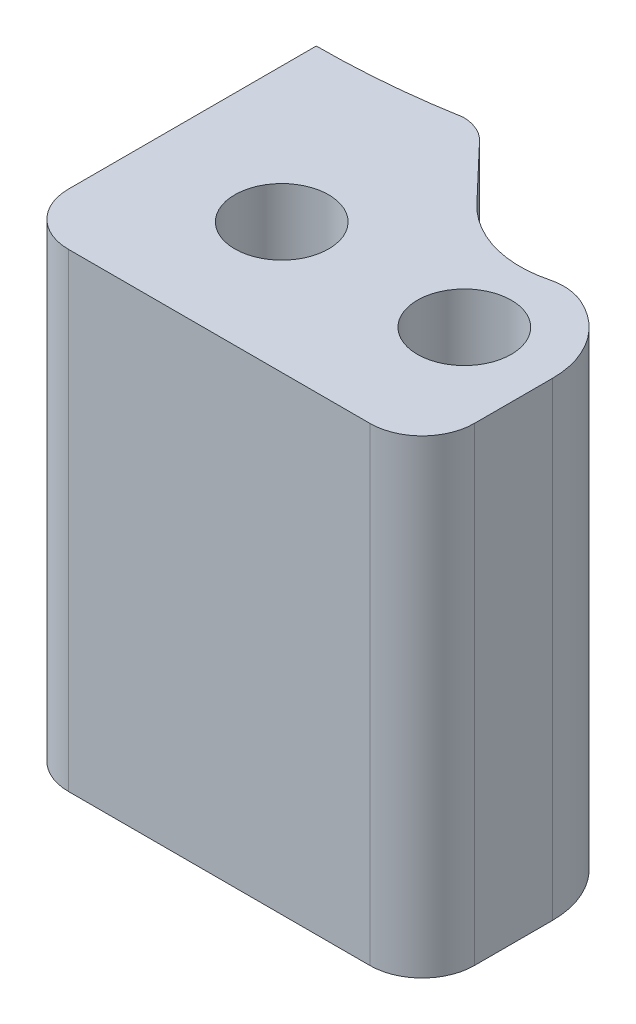
ISO-10303-21;
HEADER;
FILE_DESCRIPTION(('STEP AP214'),'2;1');
FILE_NAME('part.step','',(''),(''),'','','');
FILE_SCHEMA(('AUTOMOTIVE_DESIGN { 1 0 10303 214 1 1 1 1 }'));
ENDSEC;
DATA;
#1=APPLICATION_CONTEXT('core data for automotive mechanical design processes');
#2=APPLICATION_PROTOCOL_DEFINITION('international standard','automotive_design',2000,#1);
#3=PRODUCT_CONTEXT('',#1,'mechanical');
#4=PRODUCT('Part','Part','',(#3));
#5=PRODUCT_RELATED_PRODUCT_CATEGORY('part','',(#4));
#6=PRODUCT_DEFINITION_FORMATION('','',#4);
#7=PRODUCT_DEFINITION_CONTEXT('part definition',#1,'design');
#8=PRODUCT_DEFINITION('design','',#6,#7);
#9=PRODUCT_DEFINITION_SHAPE('','',#8);
#10=(LENGTH_UNIT() NAMED_UNIT(*) SI_UNIT(.MILLI.,.METRE.));
#11=(NAMED_UNIT(*) PLANE_ANGLE_UNIT() SI_UNIT($,.RADIAN.));
#12=(NAMED_UNIT(*) SI_UNIT($,.STERADIAN.) SOLID_ANGLE_UNIT());
#13=UNCERTAINTY_MEASURE_WITH_UNIT(LENGTH_MEASURE(1.E-05),#10,'distance_accuracy_value','');
#14=(GEOMETRIC_REPRESENTATION_CONTEXT(3) GLOBAL_UNCERTAINTY_ASSIGNED_CONTEXT((#13)) GLOBAL_UNIT_ASSIGNED_CONTEXT((#10,
#11,#12)) REPRESENTATION_CONTEXT('',''));
#15=CARTESIAN_POINT('',(0.,0.,0.));
#16=DIRECTION('',(0.,0.,1.));
#17=DIRECTION('',(1.,0.,0.));
#18=AXIS2_PLACEMENT_3D('',#15,#16,#17);
#19=CARTESIAN_POINT('',(0.,18.,0.));
#20=DIRECTION('',(0.,1.,0.));
#21=DIRECTION('',(0.,0.,1.));
#22=AXIS2_PLACEMENT_3D('',#19,#20,#21);
#23=PLANE('',#22);
#24=CARTESIAN_POINT('',(12.1760216382855,18.,36.32));
#25=DIRECTION('',(0.,1.,0.));
#26=DIRECTION('',(0.,0.,1.));
#27=AXIS2_PLACEMENT_3D('',#24,#25,#26);
#28=CIRCLE('',#27,1.8);
#29=CARTESIAN_POINT('',(12.1760216382855,18.,38.12));
#30=VERTEX_POINT('',#29);
#31=EDGE_CURVE('E236',#30,#30,#28,.T.);
#32=ORIENTED_EDGE('',*,*,#31,.F.);
#33=EDGE_LOOP('',(#32));
#34=FACE_BOUND('',#33,.T.);
#35=DIRECTION('',(1.,0.,0.));
#36=VECTOR('',#35,1.);
#37=CARTESIAN_POINT('',(0.,18.,41.32));
#38=LINE('',#37,#36);
#39=CARTESIAN_POINT('',(2.,18.,41.32));
#40=VERTEX_POINT('',#39);
#41=CARTESIAN_POINT('',(13.5596561957787,18.,41.32));
#42=VERTEX_POINT('',#41);
#43=EDGE_CURVE('E133',#40,#42,#38,.T.);
#44=ORIENTED_EDGE('',*,*,#43,.T.);
#45=CARTESIAN_POINT('',(13.5596561957787,18.,39.32));
#46=DIRECTION('',(0.,1.,0.));
#47=DIRECTION('',(0.,0.,1.));
#48=AXIS2_PLACEMENT_3D('',#45,#46,#47);
#49=CIRCLE('',#48,2.);
#50=CARTESIAN_POINT('',(15.5596561957787,18.,39.32));
#51=VERTEX_POINT('',#50);
#52=EDGE_CURVE('E47',#42,#51,#49,.T.);
#53=ORIENTED_EDGE('',*,*,#52,.T.);
#54=DIRECTION('',(0.,0.,-1.));
#55=VECTOR('',#54,1.);
#56=CARTESIAN_POINT('',(15.5596561957787,18.,36.32));
#57=LINE('',#56,#55);
#58=CARTESIAN_POINT('',(15.5596561957787,18.,36.32));
#59=VERTEX_POINT('',#58);
#60=EDGE_CURVE('E170',#51,#59,#57,.T.);
#61=ORIENTED_EDGE('',*,*,#60,.T.);
#62=CARTESIAN_POINT('',(12.1760216382855,18.,36.32));
#63=DIRECTION('',(0.,1.,0.));
#64=DIRECTION('',(0.,0.,-1.));
#65=AXIS2_PLACEMENT_3D('',#62,#63,#64);
#66=CIRCLE('',#65,3.3836345574932);
#67=CARTESIAN_POINT('',(13.5126850082592,18.,33.2115737335377));
#68=VERTEX_POINT('',#67);
#69=EDGE_CURVE('E172',#59,#68,#66,.T.);
#70=ORIENTED_EDGE('',*,*,#69,.T.);
#71=CARTESIAN_POINT('',(12.7226095156126,18.,35.048903512298));
#72=DIRECTION('',(0.,1.,0.));
#73=DIRECTION('',(0.,0.,-1.));
#74=AXIS2_PLACEMENT_3D('',#71,#72,#73);
#75=CIRCLE('',#74,2.00000000000001);
#76=CARTESIAN_POINT('',(12.2249213100975,18.,33.1118164078829));
#77=VERTEX_POINT('',#76);
#78=EDGE_CURVE('E218',#68,#77,#75,.T.);
#79=ORIENTED_EDGE('',*,*,#78,.T.);
#80=CARTESIAN_POINT('',(11.2295448990672,18.,29.2376421990528));
#81=DIRECTION('',(0.,-1.,0.));
#82=DIRECTION('',(0.,0.,1.));
#83=AXIS2_PLACEMENT_3D('',#80,#81,#82);
#84=CIRCLE('',#83,4.);
#85=CARTESIAN_POINT('',(8.33363914292527,18.,31.9969409961286));
#86=VERTEX_POINT('',#85);
#87=EDGE_CURVE('E235',#77,#86,#84,.T.);
#88=ORIENTED_EDGE('',*,*,#87,.T.);
#89=DIRECTION('',(-0.689824699268947,0.,-0.723976439035489));
#90=VECTOR('',#89,1.);
#91=CARTESIAN_POINT('',(6.27790563370873,18.,29.8394325346517));
#92=LINE('',#91,#90);
#93=CARTESIAN_POINT('',(6.27790563370873,18.,29.8394325346517));
#94=VERTEX_POINT('',#93);
#95=EDGE_CURVE('E231',#86,#94,#92,.T.);
#96=ORIENTED_EDGE('',*,*,#95,.T.);
#97=CARTESIAN_POINT('',(5.1760216382855,18.,30.8893379663599));
#98=DIRECTION('',(0.,1.,0.));
#99=DIRECTION('',(0.,0.,-1.));
#100=AXIS2_PLACEMENT_3D('',#97,#98,#99);
#101=CIRCLE('',#100,1.52198874992562);
#102=CARTESIAN_POINT('',(5.1760216382855,18.,29.3673492164342));
#103=VERTEX_POINT('',#102);
#104=EDGE_CURVE('E136',#94,#103,#101,.T.);
#105=ORIENTED_EDGE('',*,*,#104,.T.);
#106=CARTESIAN_POINT('',(0.,18.,0.));
#107=DIRECTION('',(0.,-1.,0.));
#108=DIRECTION('',(0.,0.,1.));
#109=AXIS2_PLACEMENT_3D('',#106,#107,#108);
#110=CIRCLE('',#109,29.82);
#111=CARTESIAN_POINT('',(1.58912882852746E-13,18.,29.82));
#112=VERTEX_POINT('',#111);
#113=EDGE_CURVE('E135',#103,#112,#110,.T.);
#114=ORIENTED_EDGE('',*,*,#113,.T.);
#115=DIRECTION('',(-1.04203312645268E-13,0.,1.));
#116=VECTOR('',#115,1.);
#117=CARTESIAN_POINT('',(0.,18.,31.32));
#118=LINE('',#117,#116);
#119=CARTESIAN_POINT('',(-8.31018587277298E-13,18.,39.32));
#120=VERTEX_POINT('',#119);
#121=EDGE_CURVE('E125',#112,#120,#118,.T.);
#122=ORIENTED_EDGE('',*,*,#121,.T.);
#123=CARTESIAN_POINT('',(2.,18.,39.32));
#124=DIRECTION('',(0.,1.,0.));
#125=DIRECTION('',(0.,0.,1.));
#126=AXIS2_PLACEMENT_3D('',#123,#124,#125);
#127=CIRCLE('',#126,2.);
#128=EDGE_CURVE('E163',#120,#40,#127,.T.);
#129=ORIENTED_EDGE('',*,*,#128,.T.);
#130=EDGE_LOOP('',(#44,#53,#61,#70,#79,#88,#96,#105,#114,#122,#129));
#131=FACE_BOUND('',#130,.T.);
#132=CARTESIAN_POINT('',(5.1760216382855,18.,36.32));
#133=DIRECTION('',(0.,1.,0.));
#134=DIRECTION('',(0.,0.,1.));
#135=AXIS2_PLACEMENT_3D('',#132,#133,#134);
#136=CIRCLE('',#135,1.8);
#137=CARTESIAN_POINT('',(5.1760216382855,18.,38.12));
#138=VERTEX_POINT('',#137);
#139=EDGE_CURVE('E242',#138,#138,#136,.T.);
#140=ORIENTED_EDGE('',*,*,#139,.F.);
#141=EDGE_LOOP('',(#140));
#142=FACE_BOUND('',#141,.T.);
#143=ADVANCED_FACE('F41',(#34,#131,#142),#23,.T.);
#144=CARTESIAN_POINT('',(0.,0.,0.));
#145=DIRECTION('',(0.,1.,0.));
#146=DIRECTION('',(0.,0.,1.));
#147=AXIS2_PLACEMENT_3D('',#144,#145,#146);
#148=PLANE('',#147);
#149=DIRECTION('',(0.,0.,-1.));
#150=VECTOR('',#149,1.);
#151=CARTESIAN_POINT('',(15.5596561957787,0.,36.32));
#152=LINE('',#151,#150);
#153=CARTESIAN_POINT('',(15.5596561957787,0.,39.32));
#154=VERTEX_POINT('',#153);
#155=CARTESIAN_POINT('',(15.5596561957787,0.,36.32));
#156=VERTEX_POINT('',#155);
#157=EDGE_CURVE('E184',#154,#156,#152,.T.);
#158=ORIENTED_EDGE('',*,*,#157,.F.);
#159=CARTESIAN_POINT('',(13.5596561957787,0.,39.32));
#160=DIRECTION('',(0.,1.,0.));
#161=DIRECTION('',(0.,0.,1.));
#162=AXIS2_PLACEMENT_3D('',#159,#160,#161);
#163=CIRCLE('',#162,2.);
#164=CARTESIAN_POINT('',(13.5596561957787,0.,41.32));
#165=VERTEX_POINT('',#164);
#166=EDGE_CURVE('E158',#154,#165,#163,.F.);
#167=ORIENTED_EDGE('',*,*,#166,.T.);
#168=DIRECTION('',(1.,0.,0.));
#169=VECTOR('',#168,1.);
#170=CARTESIAN_POINT('',(0.,0.,41.32));
#171=LINE('',#170,#169);
#172=CARTESIAN_POINT('',(2.,0.,41.32));
#173=VERTEX_POINT('',#172);
#174=EDGE_CURVE('E185',#173,#165,#171,.T.);
#175=ORIENTED_EDGE('',*,*,#174,.F.);
#176=CARTESIAN_POINT('',(2.,0.,39.32));
#177=DIRECTION('',(0.,1.,0.));
#178=DIRECTION('',(0.,0.,1.));
#179=AXIS2_PLACEMENT_3D('',#176,#177,#178);
#180=CIRCLE('',#179,2.);
#181=CARTESIAN_POINT('',(0.,0.,39.32));
#182=VERTEX_POINT('',#181);
#183=EDGE_CURVE('E147',#173,#182,#180,.F.);
#184=ORIENTED_EDGE('',*,*,#183,.T.);
#185=DIRECTION('',(0.,0.,1.));
#186=VECTOR('',#185,1.);
#187=CARTESIAN_POINT('',(0.,0.,41.32));
#188=LINE('',#187,#186);
#189=CARTESIAN_POINT('',(1.58912882852746E-13,0.,29.82));
#190=VERTEX_POINT('',#189);
#191=EDGE_CURVE('E190',#190,#182,#188,.T.);
#192=ORIENTED_EDGE('',*,*,#191,.F.);
#193=CARTESIAN_POINT('',(0.,0.,0.));
#194=DIRECTION('',(0.,-1.,0.));
#195=DIRECTION('',(0.,0.,1.));
#196=AXIS2_PLACEMENT_3D('',#193,#194,#195);
#197=CIRCLE('',#196,29.82);
#198=CARTESIAN_POINT('',(5.1760216382855,0.,29.3673492164342));
#199=VERTEX_POINT('',#198);
#200=EDGE_CURVE('E144',#199,#190,#197,.T.);
#201=ORIENTED_EDGE('',*,*,#200,.F.);
#202=CARTESIAN_POINT('',(5.1760216382855,0.,30.8893379663599));
#203=DIRECTION('',(0.,1.,0.));
#204=DIRECTION('',(0.,0.,-1.));
#205=AXIS2_PLACEMENT_3D('',#202,#203,#204);
#206=CIRCLE('',#205,1.52198874992562);
#207=CARTESIAN_POINT('',(6.27790563370873,0.,29.8394325346517));
#208=VERTEX_POINT('',#207);
#209=EDGE_CURVE('E143',#208,#199,#206,.T.);
#210=ORIENTED_EDGE('',*,*,#209,.F.);
#211=DIRECTION('',(-0.689824699268947,0.,-0.723976439035489));
#212=VECTOR('',#211,1.);
#213=CARTESIAN_POINT('',(6.27790563370873,0.,29.8394325346517));
#214=LINE('',#213,#212);
#215=CARTESIAN_POINT('',(8.33363914292527,0.,31.9969409961286));
#216=VERTEX_POINT('',#215);
#217=EDGE_CURVE('E200',#216,#208,#214,.T.);
#218=ORIENTED_EDGE('',*,*,#217,.F.);
#219=CARTESIAN_POINT('',(11.2295448990672,0.,29.2376421990528));
#220=DIRECTION('',(0.,-1.,0.));
#221=DIRECTION('',(0.,0.,1.));
#222=AXIS2_PLACEMENT_3D('',#219,#220,#221);
#223=CIRCLE('',#222,4.);
#224=CARTESIAN_POINT('',(12.2249213100975,0.,33.1118164078829));
#225=VERTEX_POINT('',#224);
#226=EDGE_CURVE('E197',#225,#216,#223,.T.);
#227=ORIENTED_EDGE('',*,*,#226,.F.);
#228=CARTESIAN_POINT('',(12.7226095156126,0.,35.048903512298));
#229=DIRECTION('',(0.,1.,0.));
#230=DIRECTION('',(0.,0.,-1.));
#231=AXIS2_PLACEMENT_3D('',#228,#229,#230);
#232=CIRCLE('',#231,2.00000000000001);
#233=CARTESIAN_POINT('',(13.5126850082592,0.,33.2115737335377));
#234=VERTEX_POINT('',#233);
#235=EDGE_CURVE('E192',#234,#225,#232,.T.);
#236=ORIENTED_EDGE('',*,*,#235,.F.);
#237=CARTESIAN_POINT('',(12.1760216382855,0.,36.32));
#238=DIRECTION('',(0.,1.,0.));
#239=DIRECTION('',(0.,0.,-1.));
#240=AXIS2_PLACEMENT_3D('',#237,#238,#239);
#241=CIRCLE('',#240,3.3836345574932);
#242=EDGE_CURVE('E189',#156,#234,#241,.T.);
#243=ORIENTED_EDGE('',*,*,#242,.F.);
#244=EDGE_LOOP('',(#158,#167,#175,#184,#192,#201,#210,#218,#227,#236,#243));
#245=FACE_BOUND('',#244,.T.);
#246=CARTESIAN_POINT('',(12.1760216382855,0.,36.32));
#247=DIRECTION('',(0.,1.,0.));
#248=DIRECTION('',(0.,0.,1.));
#249=AXIS2_PLACEMENT_3D('',#246,#247,#248);
#250=CIRCLE('',#249,1.8);
#251=CARTESIAN_POINT('',(12.1760216382855,0.,38.12));
#252=VERTEX_POINT('',#251);
#253=EDGE_CURVE('E238',#252,#252,#250,.T.);
#254=ORIENTED_EDGE('',*,*,#253,.T.);
#255=EDGE_LOOP('',(#254));
#256=FACE_BOUND('',#255,.T.);
#257=CARTESIAN_POINT('',(5.1760216382855,0.,36.32));
#258=DIRECTION('',(0.,1.,0.));
#259=DIRECTION('',(0.,0.,1.));
#260=AXIS2_PLACEMENT_3D('',#257,#258,#259);
#261=CIRCLE('',#260,1.8);
#262=CARTESIAN_POINT('',(5.1760216382855,0.,38.12));
#263=VERTEX_POINT('',#262);
#264=EDGE_CURVE('E250',#263,#263,#261,.T.);
#265=ORIENTED_EDGE('',*,*,#264,.T.);
#266=EDGE_LOOP('',(#265));
#267=FACE_BOUND('',#266,.T.);
#268=ADVANCED_FACE('F177',(#245,#256,#267),#148,.F.);
#269=CARTESIAN_POINT('',(0.,18.,0.));
#270=DIRECTION('',(0.,-1.,0.));
#271=DIRECTION('',(0.,0.,-1.));
#272=AXIS2_PLACEMENT_3D('',#269,#270,#271);
#273=CYLINDRICAL_SURFACE('',#272,29.82);
#274=ORIENTED_EDGE('',*,*,#200,.T.);
#275=DIRECTION('',(0.,-1.,0.));
#276=VECTOR('',#275,1.);
#277=CARTESIAN_POINT('',(1.58912882852746E-13,18.,29.82));
#278=LINE('',#277,#276);
#279=EDGE_CURVE('E130',#112,#190,#278,.T.);
#280=ORIENTED_EDGE('',*,*,#279,.F.);
#281=ORIENTED_EDGE('',*,*,#113,.F.);
#282=DIRECTION('',(0.,-1.,0.));
#283=VECTOR('',#282,1.);
#284=CARTESIAN_POINT('',(5.1760216382855,18.,29.3673492164342));
#285=LINE('',#284,#283);
#286=EDGE_CURVE('E205',#103,#199,#285,.T.);
#287=ORIENTED_EDGE('',*,*,#286,.T.);
#288=EDGE_LOOP('',(#274,#280,#281,#287));
#289=FACE_BOUND('',#288,.T.);
#290=ADVANCED_FACE('F141',(#289),#273,.F.);
#291=CARTESIAN_POINT('',(0.,18.,41.32));
#292=DIRECTION('',(1.,0.,0.));
#293=DIRECTION('',(0.,0.,-1.));
#294=AXIS2_PLACEMENT_3D('',#291,#292,#293);
#295=PLANE('',#294);
#296=ORIENTED_EDGE('',*,*,#191,.T.);
#297=DIRECTION('',(0.,-1.,0.));
#298=VECTOR('',#297,1.);
#299=CARTESIAN_POINT('',(0.,18.,39.32));
#300=LINE('',#299,#298);
#301=EDGE_CURVE('E11',#182,#120,#300,.F.);
#302=ORIENTED_EDGE('',*,*,#301,.T.);
#303=ORIENTED_EDGE('',*,*,#121,.F.);
#304=ORIENTED_EDGE('',*,*,#279,.T.);
#305=EDGE_LOOP('',(#296,#302,#303,#304));
#306=FACE_BOUND('',#305,.T.);
#307=ADVANCED_FACE('F122',(#306),#295,.F.);
#308=CARTESIAN_POINT('',(0.,18.,41.32));
#309=DIRECTION('',(0.,0.,-1.));
#310=DIRECTION('',(-1.,0.,0.));
#311=AXIS2_PLACEMENT_3D('',#308,#309,#310);
#312=PLANE('',#311);
#313=ORIENTED_EDGE('',*,*,#174,.T.);
#314=DIRECTION('',(0.,-1.,0.));
#315=VECTOR('',#314,1.);
#316=CARTESIAN_POINT('',(13.5596561957787,18.,41.32));
#317=LINE('',#316,#315);
#318=EDGE_CURVE('E65',#165,#42,#317,.F.);
#319=ORIENTED_EDGE('',*,*,#318,.T.);
#320=ORIENTED_EDGE('',*,*,#43,.F.);
#321=DIRECTION('',(0.,-1.,0.));
#322=VECTOR('',#321,1.);
#323=CARTESIAN_POINT('',(2.,18.,41.32));
#324=LINE('',#323,#322);
#325=EDGE_CURVE('E159',#40,#173,#324,.T.);
#326=ORIENTED_EDGE('',*,*,#325,.T.);
#327=EDGE_LOOP('',(#313,#319,#320,#326));
#328=FACE_BOUND('',#327,.T.);
#329=ADVANCED_FACE('F183',(#328),#312,.F.);
#330=CARTESIAN_POINT('',(15.5596561957787,18.,36.32));
#331=DIRECTION('',(-1.,0.,0.));
#332=DIRECTION('',(0.,0.,1.));
#333=AXIS2_PLACEMENT_3D('',#330,#331,#332);
#334=PLANE('',#333);
#335=ORIENTED_EDGE('',*,*,#60,.F.);
#336=DIRECTION('',(0.,-1.,0.));
#337=VECTOR('',#336,1.);
#338=CARTESIAN_POINT('',(15.5596561957787,18.,39.32));
#339=LINE('',#338,#337);
#340=EDGE_CURVE('E148',#51,#154,#339,.T.);
#341=ORIENTED_EDGE('',*,*,#340,.T.);
#342=ORIENTED_EDGE('',*,*,#157,.T.);
#343=DIRECTION('',(0.,-1.,0.));
#344=VECTOR('',#343,1.);
#345=CARTESIAN_POINT('',(15.5596561957787,18.,36.32));
#346=LINE('',#345,#344);
#347=EDGE_CURVE('E150',#59,#156,#346,.T.);
#348=ORIENTED_EDGE('',*,*,#347,.F.);
#349=EDGE_LOOP('',(#335,#341,#342,#348));
#350=FACE_BOUND('',#349,.T.);
#351=ADVANCED_FACE('F175',(#350),#334,.F.);
#352=CARTESIAN_POINT('',(12.1760216382855,18.,36.32));
#353=DIRECTION('',(0.,-1.,0.));
#354=DIRECTION('',(0.,0.,-1.));
#355=AXIS2_PLACEMENT_3D('',#352,#353,#354);
#356=CYLINDRICAL_SURFACE('',#355,3.3836345574932);
#357=ORIENTED_EDGE('',*,*,#242,.T.);
#358=DIRECTION('',(0.,-1.,0.));
#359=VECTOR('',#358,1.);
#360=CARTESIAN_POINT('',(13.5126850082592,18.,33.2115737335377));
#361=LINE('',#360,#359);
#362=EDGE_CURVE('E153',#68,#234,#361,.T.);
#363=ORIENTED_EDGE('',*,*,#362,.F.);
#364=ORIENTED_EDGE('',*,*,#69,.F.);
#365=ORIENTED_EDGE('',*,*,#347,.T.);
#366=EDGE_LOOP('',(#357,#363,#364,#365));
#367=FACE_BOUND('',#366,.T.);
#368=ADVANCED_FACE('F252',(#367),#356,.T.);
#369=CARTESIAN_POINT('',(12.7226095156126,18.,35.048903512298));
#370=DIRECTION('',(0.,-1.,0.));
#371=DIRECTION('',(0.,0.,-1.));
#372=AXIS2_PLACEMENT_3D('',#369,#370,#371);
#373=CYLINDRICAL_SURFACE('',#372,2.00000000000001);
#374=ORIENTED_EDGE('',*,*,#235,.T.);
#375=DIRECTION('',(0.,-1.,0.));
#376=VECTOR('',#375,1.);
#377=CARTESIAN_POINT('',(12.2249213100975,18.,33.1118164078829));
#378=LINE('',#377,#376);
#379=EDGE_CURVE('E209',#77,#225,#378,.T.);
#380=ORIENTED_EDGE('',*,*,#379,.F.);
#381=ORIENTED_EDGE('',*,*,#78,.F.);
#382=ORIENTED_EDGE('',*,*,#362,.T.);
#383=EDGE_LOOP('',(#374,#380,#381,#382));
#384=FACE_BOUND('',#383,.T.);
#385=ADVANCED_FACE('F220',(#384),#373,.T.);
#386=CARTESIAN_POINT('',(11.2295448990672,18.,29.2376421990528));
#387=DIRECTION('',(0.,-1.,0.));
#388=DIRECTION('',(0.,0.,-1.));
#389=AXIS2_PLACEMENT_3D('',#386,#387,#388);
#390=CYLINDRICAL_SURFACE('',#389,4.);
#391=ORIENTED_EDGE('',*,*,#226,.T.);
#392=DIRECTION('',(0.,-1.,0.));
#393=VECTOR('',#392,1.);
#394=CARTESIAN_POINT('',(8.33363914292527,18.,31.9969409961286));
#395=LINE('',#394,#393);
#396=EDGE_CURVE('E210',#86,#216,#395,.T.);
#397=ORIENTED_EDGE('',*,*,#396,.F.);
#398=ORIENTED_EDGE('',*,*,#87,.F.);
#399=ORIENTED_EDGE('',*,*,#379,.T.);
#400=EDGE_LOOP('',(#391,#397,#398,#399));
#401=FACE_BOUND('',#400,.T.);
#402=ADVANCED_FACE('F228',(#401),#390,.F.);
#403=CARTESIAN_POINT('',(6.27790563370873,18.,29.8394325346517));
#404=DIRECTION('',(-0.723976439035489,0.,0.689824699268947));
#405=DIRECTION('',(0.689824699268947,0.,0.723976439035489));
#406=AXIS2_PLACEMENT_3D('',#403,#404,#405);
#407=PLANE('',#406);
#408=ORIENTED_EDGE('',*,*,#217,.T.);
#409=DIRECTION('',(0.,-1.,0.));
#410=VECTOR('',#409,1.);
#411=CARTESIAN_POINT('',(6.27790563370873,18.,29.8394325346517));
#412=LINE('',#411,#410);
#413=EDGE_CURVE('E204',#94,#208,#412,.T.);
#414=ORIENTED_EDGE('',*,*,#413,.F.);
#415=ORIENTED_EDGE('',*,*,#95,.F.);
#416=ORIENTED_EDGE('',*,*,#396,.T.);
#417=EDGE_LOOP('',(#408,#414,#415,#416));
#418=FACE_BOUND('',#417,.T.);
#419=ADVANCED_FACE('F227',(#418),#407,.F.);
#420=CARTESIAN_POINT('',(5.1760216382855,18.,30.8893379663599));
#421=DIRECTION('',(0.,-1.,0.));
#422=DIRECTION('',(0.,0.,-1.));
#423=AXIS2_PLACEMENT_3D('',#420,#421,#422);
#424=CYLINDRICAL_SURFACE('',#423,1.52198874992562);
#425=ORIENTED_EDGE('',*,*,#209,.T.);
#426=ORIENTED_EDGE('',*,*,#286,.F.);
#427=ORIENTED_EDGE('',*,*,#104,.F.);
#428=ORIENTED_EDGE('',*,*,#413,.T.);
#429=EDGE_LOOP('',(#425,#426,#427,#428));
#430=FACE_BOUND('',#429,.T.);
#431=ADVANCED_FACE('F273',(#430),#424,.T.);
#432=CARTESIAN_POINT('',(12.1760216382855,18.,36.32));
#433=DIRECTION('',(0.,-1.,0.));
#434=DIRECTION('',(0.,0.,-1.));
#435=AXIS2_PLACEMENT_3D('',#432,#433,#434);
#436=CYLINDRICAL_SURFACE('',#435,1.8);
#437=ORIENTED_EDGE('',*,*,#31,.T.);
#438=EDGE_LOOP('',(#437));
#439=FACE_BOUND('',#438,.T.);
#440=ORIENTED_EDGE('',*,*,#253,.F.);
#441=EDGE_LOOP('',(#440));
#442=FACE_BOUND('',#441,.T.);
#443=ADVANCED_FACE('F271',(#439,#442),#436,.F.);
#444=CARTESIAN_POINT('',(5.1760216382855,18.,36.32));
#445=DIRECTION('',(0.,-1.,0.));
#446=DIRECTION('',(0.,0.,-1.));
#447=AXIS2_PLACEMENT_3D('',#444,#445,#446);
#448=CYLINDRICAL_SURFACE('',#447,1.8);
#449=ORIENTED_EDGE('',*,*,#139,.T.);
#450=EDGE_LOOP('',(#449));
#451=FACE_BOUND('',#450,.T.);
#452=ORIENTED_EDGE('',*,*,#264,.F.);
#453=EDGE_LOOP('',(#452));
#454=FACE_BOUND('',#453,.T.);
#455=ADVANCED_FACE('F304',(#451,#454),#448,.F.);
#456=CARTESIAN_POINT('',(13.5596561957787,18.,39.32));
#457=DIRECTION('',(0.,-1.,0.));
#458=DIRECTION('',(0.,0.,-1.));
#459=AXIS2_PLACEMENT_3D('',#456,#457,#458);
#460=CYLINDRICAL_SURFACE('',#459,2.);
#461=ORIENTED_EDGE('',*,*,#52,.F.);
#462=ORIENTED_EDGE('',*,*,#318,.F.);
#463=ORIENTED_EDGE('',*,*,#166,.F.);
#464=ORIENTED_EDGE('',*,*,#340,.F.);
#465=EDGE_LOOP('',(#461,#462,#463,#464));
#466=FACE_BOUND('',#465,.T.);
#467=ADVANCED_FACE('F176',(#466),#460,.T.);
#468=CARTESIAN_POINT('',(2.,18.,39.32));
#469=DIRECTION('',(0.,-1.,0.));
#470=DIRECTION('',(0.,0.,-1.));
#471=AXIS2_PLACEMENT_3D('',#468,#469,#470);
#472=CYLINDRICAL_SURFACE('',#471,2.);
#473=ORIENTED_EDGE('',*,*,#128,.F.);
#474=ORIENTED_EDGE('',*,*,#301,.F.);
#475=ORIENTED_EDGE('',*,*,#183,.F.);
#476=ORIENTED_EDGE('',*,*,#325,.F.);
#477=EDGE_LOOP('',(#473,#474,#475,#476));
#478=FACE_BOUND('',#477,.T.);
#479=ADVANCED_FACE('F43',(#478),#472,.T.);
#480=CLOSED_SHELL('',(#143,#268,#290,#307,#329,#351,#368,#385,#402,#419,#431,#443,#455,#467,#479));
#481=MANIFOLD_SOLID_BREP('B2',#480);
#482=ADVANCED_BREP_SHAPE_REPRESENTATION('',(#18,#481),#14);
#483=SHAPE_DEFINITION_REPRESENTATION(#9,#482);
ENDSEC;
END-ISO-10303-21;
